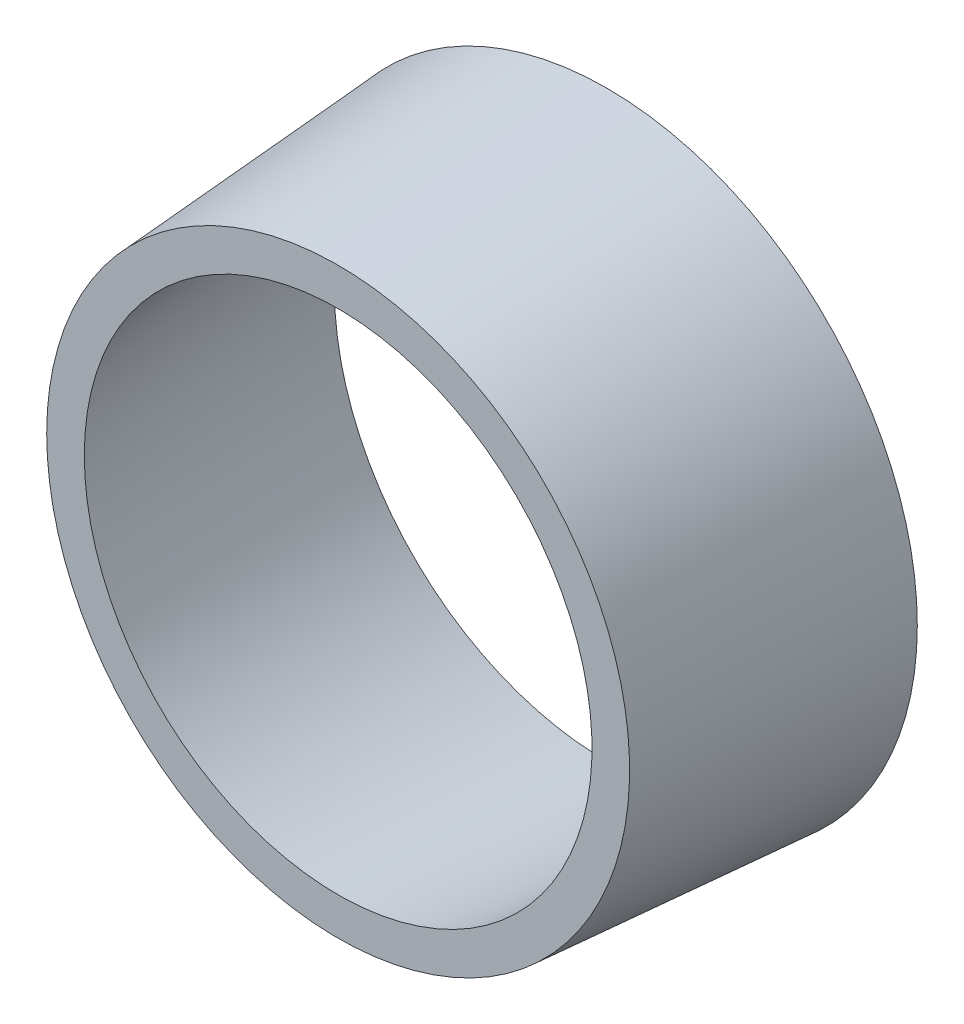
ISO-10303-21;
HEADER;
FILE_DESCRIPTION(('STEP AP214'),'2;1');
FILE_NAME('part.step','',(''),(''),'','','');
FILE_SCHEMA(('AUTOMOTIVE_DESIGN { 1 0 10303 214 1 1 1 1 }'));
ENDSEC;
DATA;
#1=APPLICATION_CONTEXT('core data for automotive mechanical design processes');
#2=APPLICATION_PROTOCOL_DEFINITION('international standard','automotive_design',2000,#1);
#3=PRODUCT_CONTEXT('',#1,'mechanical');
#4=PRODUCT('Part','Part','',(#3));
#5=PRODUCT_RELATED_PRODUCT_CATEGORY('part','',(#4));
#6=PRODUCT_DEFINITION_FORMATION('','',#4);
#7=PRODUCT_DEFINITION_CONTEXT('part definition',#1,'design');
#8=PRODUCT_DEFINITION('design','',#6,#7);
#9=PRODUCT_DEFINITION_SHAPE('','',#8);
#10=(LENGTH_UNIT() NAMED_UNIT(*) SI_UNIT(.MILLI.,.METRE.));
#11=(NAMED_UNIT(*) PLANE_ANGLE_UNIT() SI_UNIT($,.RADIAN.));
#12=(NAMED_UNIT(*) SI_UNIT($,.STERADIAN.) SOLID_ANGLE_UNIT());
#13=UNCERTAINTY_MEASURE_WITH_UNIT(LENGTH_MEASURE(1.E-05),#10,'distance_accuracy_value','');
#14=(GEOMETRIC_REPRESENTATION_CONTEXT(3) GLOBAL_UNCERTAINTY_ASSIGNED_CONTEXT((#13)) GLOBAL_UNIT_ASSIGNED_CONTEXT((#10,
#11,#12)) REPRESENTATION_CONTEXT('',''));
#15=CARTESIAN_POINT('',(0.,0.,0.));
#16=DIRECTION('',(0.,0.,1.));
#17=DIRECTION('',(1.,0.,0.));
#18=AXIS2_PLACEMENT_3D('',#15,#16,#17);
#19=CARTESIAN_POINT('',(0.,0.,0.));
#20=DIRECTION('',(0.,0.,-1.));
#21=DIRECTION('',(-1.,0.,0.));
#22=AXIS2_PLACEMENT_3D('',#19,#20,#21);
#23=CONICAL_SURFACE('',#22,20.955,0.0698131700797731);
#24=CARTESIAN_POINT('',(0.,0.,18.1618461460241));
#25=DIRECTION('',(0.,0.,-1.));
#26=DIRECTION('',(-1.,0.,0.));
#27=AXIS2_PLACEMENT_3D('',#24,#25,#26);
#28=CIRCLE('',#27,19.685);
#29=CARTESIAN_POINT('',(-19.685,0.,18.1618461460241));
#30=VERTEX_POINT('',#29);
#31=EDGE_CURVE('E10',#30,#30,#28,.T.);
#32=ORIENTED_EDGE('',*,*,#31,.T.);
#33=EDGE_LOOP('',(#32));
#34=FACE_BOUND('',#33,.T.);
#35=CARTESIAN_POINT('',(0.,0.,0.));
#36=DIRECTION('',(0.,0.,-1.));
#37=DIRECTION('',(-1.,0.,0.));
#38=AXIS2_PLACEMENT_3D('',#35,#36,#37);
#39=CIRCLE('',#38,20.955);
#40=CARTESIAN_POINT('',(-20.955,0.,0.));
#41=VERTEX_POINT('',#40);
#42=EDGE_CURVE('E51',#41,#41,#39,.T.);
#43=ORIENTED_EDGE('',*,*,#42,.F.);
#44=EDGE_LOOP('',(#43));
#45=FACE_BOUND('',#44,.T.);
#46=ADVANCED_FACE('F37',(#34,#45),#23,.T.);
#47=CARTESIAN_POINT('',(0.,19.685,18.1618461460241));
#48=DIRECTION('',(0.,0.,1.));
#49=DIRECTION('',(1.,0.,0.));
#50=AXIS2_PLACEMENT_3D('',#47,#48,#49);
#51=PLANE('',#50);
#52=CARTESIAN_POINT('',(0.,0.,18.1618461460241));
#53=DIRECTION('',(0.,0.,-1.));
#54=DIRECTION('',(-1.,0.,0.));
#55=AXIS2_PLACEMENT_3D('',#52,#53,#54);
#56=CIRCLE('',#55,17.145);
#57=CARTESIAN_POINT('',(-17.145,0.,18.1618461460241));
#58=VERTEX_POINT('',#57);
#59=EDGE_CURVE('E43',#58,#58,#56,.T.);
#60=ORIENTED_EDGE('',*,*,#59,.T.);
#61=EDGE_LOOP('',(#60));
#62=FACE_BOUND('',#61,.T.);
#63=ORIENTED_EDGE('',*,*,#31,.F.);
#64=EDGE_LOOP('',(#63));
#65=FACE_BOUND('',#64,.T.);
#66=ADVANCED_FACE('F61',(#62,#65),#51,.T.);
#67=CARTESIAN_POINT('',(0.,0.,18.1618461460241));
#68=DIRECTION('',(0.,0.,-1.));
#69=DIRECTION('',(-1.,0.,0.));
#70=AXIS2_PLACEMENT_3D('',#67,#68,#69);
#71=CONICAL_SURFACE('',#70,17.145,0.0698131700797735);
#72=CARTESIAN_POINT('',(0.,0.,0.));
#73=DIRECTION('',(0.,0.,-1.));
#74=DIRECTION('',(-1.,0.,0.));
#75=AXIS2_PLACEMENT_3D('',#72,#73,#74);
#76=CIRCLE('',#75,18.415);
#77=CARTESIAN_POINT('',(-18.415,0.,0.));
#78=VERTEX_POINT('',#77);
#79=EDGE_CURVE('E47',#78,#78,#76,.T.);
#80=ORIENTED_EDGE('',*,*,#79,.T.);
#81=EDGE_LOOP('',(#80));
#82=FACE_BOUND('',#81,.T.);
#83=ORIENTED_EDGE('',*,*,#59,.F.);
#84=EDGE_LOOP('',(#83));
#85=FACE_BOUND('',#84,.T.);
#86=ADVANCED_FACE('F65',(#82,#85),#71,.F.);
#87=CARTESIAN_POINT('',(0.,18.415,0.));
#88=DIRECTION('',(0.,0.,-1.));
#89=DIRECTION('',(-1.,0.,0.));
#90=AXIS2_PLACEMENT_3D('',#87,#88,#89);
#91=PLANE('',#90);
#92=ORIENTED_EDGE('',*,*,#42,.T.);
#93=EDGE_LOOP('',(#92));
#94=FACE_BOUND('',#93,.T.);
#95=ORIENTED_EDGE('',*,*,#79,.F.);
#96=EDGE_LOOP('',(#95));
#97=FACE_BOUND('',#96,.T.);
#98=ADVANCED_FACE('F57',(#94,#97),#91,.T.);
#99=CLOSED_SHELL('',(#46,#66,#86,#98));
#100=MANIFOLD_SOLID_BREP('B2',#99);
#101=ADVANCED_BREP_SHAPE_REPRESENTATION('',(#18,#100),#14);
#102=SHAPE_DEFINITION_REPRESENTATION(#9,#101);
ENDSEC;
END-ISO-10303-21;
